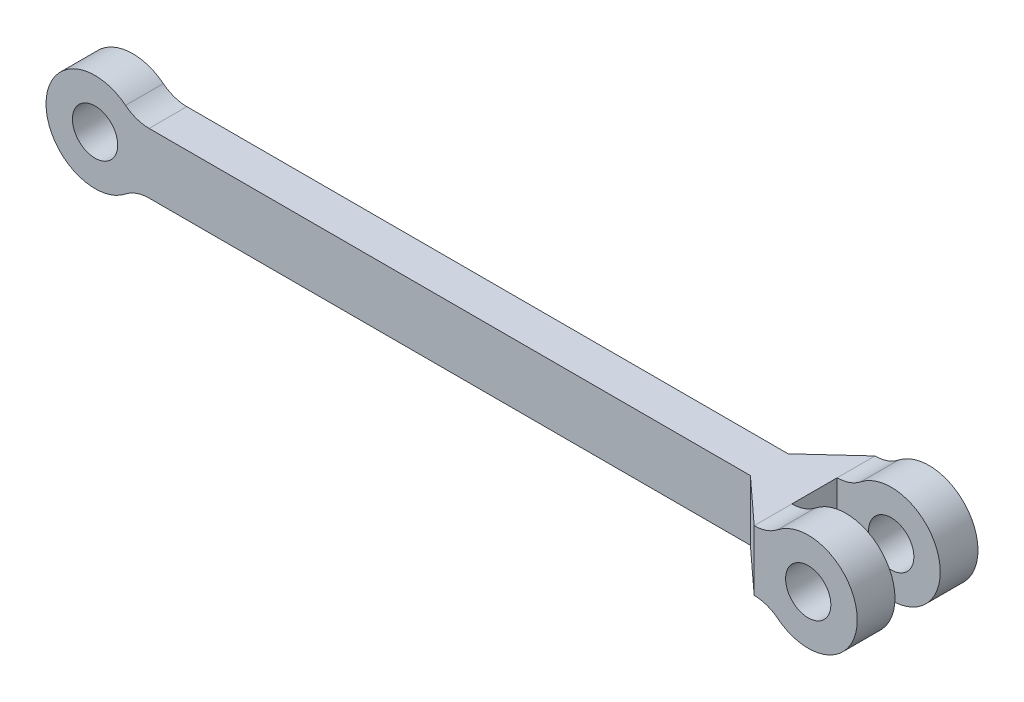
ISO-10303-21;
HEADER;
FILE_DESCRIPTION(('STEP AP214'),'2;1');
FILE_NAME('part.step','',(''),(''),'','','');
FILE_SCHEMA(('AUTOMOTIVE_DESIGN { 1 0 10303 214 1 1 1 1 }'));
ENDSEC;
DATA;
#1=APPLICATION_CONTEXT('core data for automotive mechanical design processes');
#2=APPLICATION_PROTOCOL_DEFINITION('international standard','automotive_design',2000,#1);
#3=PRODUCT_CONTEXT('',#1,'mechanical');
#4=PRODUCT('Part','Part','',(#3));
#5=PRODUCT_RELATED_PRODUCT_CATEGORY('part','',(#4));
#6=PRODUCT_DEFINITION_FORMATION('','',#4);
#7=PRODUCT_DEFINITION_CONTEXT('part definition',#1,'design');
#8=PRODUCT_DEFINITION('design','',#6,#7);
#9=PRODUCT_DEFINITION_SHAPE('','',#8);
#10=(LENGTH_UNIT() NAMED_UNIT(*) SI_UNIT(.MILLI.,.METRE.));
#11=(NAMED_UNIT(*) PLANE_ANGLE_UNIT() SI_UNIT($,.RADIAN.));
#12=(NAMED_UNIT(*) SI_UNIT($,.STERADIAN.) SOLID_ANGLE_UNIT());
#13=UNCERTAINTY_MEASURE_WITH_UNIT(LENGTH_MEASURE(1.E-05),#10,'distance_accuracy_value','');
#14=(GEOMETRIC_REPRESENTATION_CONTEXT(3) GLOBAL_UNCERTAINTY_ASSIGNED_CONTEXT((#13)) GLOBAL_UNIT_ASSIGNED_CONTEXT((#10,
#11,#12)) REPRESENTATION_CONTEXT('',''));
#15=CARTESIAN_POINT('',(0.,0.,0.));
#16=DIRECTION('',(0.,0.,1.));
#17=DIRECTION('',(1.,0.,0.));
#18=AXIS2_PLACEMENT_3D('',#15,#16,#17);
#19=CARTESIAN_POINT('',(928.410894683618,-90.,25.));
#20=DIRECTION('',(0.,0.,-1.));
#21=DIRECTION('',(-1.,0.,0.));
#22=AXIS2_PLACEMENT_3D('',#19,#20,#21);
#23=CYLINDRICAL_SURFACE('',#22,50.);
#24=DIRECTION('',(0.,0.,-1.));
#25=VECTOR('',#24,1.);
#26=CARTESIAN_POINT('',(928.410894683618,-40.,25.));
#27=LINE('',#26,#25);
#28=CARTESIAN_POINT('',(928.410894683618,-40.,80.));
#29=VERTEX_POINT('',#28);
#30=CARTESIAN_POINT('',(928.410894683618,-40.,30.));
#31=VERTEX_POINT('',#30);
#32=EDGE_CURVE('E160',#29,#31,#27,.T.);
#33=ORIENTED_EDGE('',*,*,#32,.T.);
#34=CARTESIAN_POINT('',(928.410894683618,-90.,30.));
#35=DIRECTION('',(0.,0.,1.));
#36=DIRECTION('',(1.,0.,0.));
#37=AXIS2_PLACEMENT_3D('',#34,#35,#36);
#38=CIRCLE('',#37,50.);
#39=CARTESIAN_POINT('',(959.536592647262,-50.8695652173913,30.));
#40=VERTEX_POINT('',#39);
#41=EDGE_CURVE('E229',#31,#40,#38,.F.);
#42=ORIENTED_EDGE('',*,*,#41,.T.);
#43=DIRECTION('',(0.,0.,-1.));
#44=VECTOR('',#43,1.);
#45=CARTESIAN_POINT('',(959.536592647262,-50.8695652173913,25.));
#46=LINE('',#45,#44);
#47=CARTESIAN_POINT('',(959.536592647262,-50.8695652173913,80.));
#48=VERTEX_POINT('',#47);
#49=EDGE_CURVE('E202',#48,#40,#46,.T.);
#50=ORIENTED_EDGE('',*,*,#49,.F.);
#51=CARTESIAN_POINT('',(928.410894683618,-90.,80.));
#52=DIRECTION('',(0.,0.,-1.));
#53=DIRECTION('',(1.,0.,0.));
#54=AXIS2_PLACEMENT_3D('',#51,#52,#53);
#55=CIRCLE('',#54,50.);
#56=EDGE_CURVE('E248',#29,#48,#55,.T.);
#57=ORIENTED_EDGE('',*,*,#56,.F.);
#58=EDGE_LOOP('',(#33,#42,#50,#57));
#59=FACE_BOUND('',#58,.T.);
#60=ADVANCED_FACE('F33',(#59),#23,.F.);
#61=CARTESIAN_POINT('',(1000.,0.,25.));
#62=DIRECTION('',(0.,0.,-1.));
#63=DIRECTION('',(-1.,0.,0.));
#64=AXIS2_PLACEMENT_3D('',#61,#62,#63);
#65=CYLINDRICAL_SURFACE('',#64,65.);
#66=DIRECTION('',(0.,0.,-1.));
#67=VECTOR('',#66,1.);
#68=CARTESIAN_POINT('',(959.536592647262,50.8695652173913,25.));
#69=LINE('',#68,#67);
#70=CARTESIAN_POINT('',(959.536592647262,50.8695652173913,-30.));
#71=VERTEX_POINT('',#70);
#72=CARTESIAN_POINT('',(959.536592647262,50.8695652173913,-80.));
#73=VERTEX_POINT('',#72);
#74=EDGE_CURVE('E197',#71,#73,#69,.T.);
#75=ORIENTED_EDGE('',*,*,#74,.F.);
#76=CARTESIAN_POINT('',(1000.,0.,-30.));
#77=DIRECTION('',(0.,0.,-1.));
#78=DIRECTION('',(-1.,0.,0.));
#79=AXIS2_PLACEMENT_3D('',#76,#77,#78);
#80=CIRCLE('',#79,65.);
#81=CARTESIAN_POINT('',(959.536592647262,-50.8695652173913,-30.));
#82=VERTEX_POINT('',#81);
#83=EDGE_CURVE('E212',#71,#82,#80,.T.);
#84=ORIENTED_EDGE('',*,*,#83,.T.);
#85=CARTESIAN_POINT('',(959.536592647262,-50.8695652173913,-80.));
#86=VERTEX_POINT('',#85);
#87=EDGE_CURVE('E201',#82,#86,#46,.T.);
#88=ORIENTED_EDGE('',*,*,#87,.T.);
#89=CARTESIAN_POINT('',(1000.,0.,-80.));
#90=DIRECTION('',(0.,0.,1.));
#91=DIRECTION('',(1.,0.,0.));
#92=AXIS2_PLACEMENT_3D('',#89,#90,#91);
#93=CIRCLE('',#92,65.);
#94=EDGE_CURVE('E260',#86,#73,#93,.T.);
#95=ORIENTED_EDGE('',*,*,#94,.T.);
#96=EDGE_LOOP('',(#75,#84,#88,#95));
#97=FACE_BOUND('',#96,.T.);
#98=ADVANCED_FACE('F310',(#97),#65,.T.);
#99=CARTESIAN_POINT('',(928.410894683618,90.,25.));
#100=DIRECTION('',(0.,0.,-1.));
#101=DIRECTION('',(-1.,0.,0.));
#102=AXIS2_PLACEMENT_3D('',#99,#100,#101);
#103=CYLINDRICAL_SURFACE('',#102,50.);
#104=CARTESIAN_POINT('',(959.536592647262,50.8695652173913,80.));
#105=VERTEX_POINT('',#104);
#106=CARTESIAN_POINT('',(959.536592647262,50.8695652173913,30.));
#107=VERTEX_POINT('',#106);
#108=EDGE_CURVE('E198',#105,#107,#69,.T.);
#109=ORIENTED_EDGE('',*,*,#108,.T.);
#110=CARTESIAN_POINT('',(928.410894683618,90.,30.));
#111=DIRECTION('',(0.,0.,1.));
#112=DIRECTION('',(1.,0.,0.));
#113=AXIS2_PLACEMENT_3D('',#110,#111,#112);
#114=CIRCLE('',#113,50.);
#115=CARTESIAN_POINT('',(928.410894683618,40.,30.));
#116=VERTEX_POINT('',#115);
#117=EDGE_CURVE('E224',#107,#116,#114,.F.);
#118=ORIENTED_EDGE('',*,*,#117,.T.);
#119=DIRECTION('',(0.,0.,-1.));
#120=VECTOR('',#119,1.);
#121=CARTESIAN_POINT('',(928.410894683618,40.,25.));
#122=LINE('',#121,#120);
#123=CARTESIAN_POINT('',(928.410894683618,40.,80.));
#124=VERTEX_POINT('',#123);
#125=EDGE_CURVE('E194',#124,#116,#122,.T.);
#126=ORIENTED_EDGE('',*,*,#125,.F.);
#127=CARTESIAN_POINT('',(928.410894683618,90.,80.));
#128=DIRECTION('',(0.,0.,-1.));
#129=DIRECTION('',(1.,0.,0.));
#130=AXIS2_PLACEMENT_3D('',#127,#128,#129);
#131=CIRCLE('',#130,50.);
#132=EDGE_CURVE('E255',#105,#124,#131,.T.);
#133=ORIENTED_EDGE('',*,*,#132,.F.);
#134=EDGE_LOOP('',(#109,#118,#126,#133));
#135=FACE_BOUND('',#134,.T.);
#136=ADVANCED_FACE('F312',(#135),#103,.F.);
#137=CARTESIAN_POINT('',(1000.,0.,25.));
#138=DIRECTION('',(0.,0.,-1.));
#139=DIRECTION('',(-1.,0.,0.));
#140=AXIS2_PLACEMENT_3D('',#137,#138,#139);
#141=CYLINDRICAL_SURFACE('',#140,30.);
#142=CARTESIAN_POINT('',(1000.,0.,30.));
#143=DIRECTION('',(0.,0.,1.));
#144=DIRECTION('',(1.,0.,0.));
#145=AXIS2_PLACEMENT_3D('',#142,#143,#144);
#146=CIRCLE('',#145,30.);
#147=CARTESIAN_POINT('',(1030.,0.,30.));
#148=VERTEX_POINT('',#147);
#149=EDGE_CURVE('E37',#148,#148,#146,.T.);
#150=ORIENTED_EDGE('',*,*,#149,.F.);
#151=EDGE_LOOP('',(#150));
#152=FACE_BOUND('',#151,.T.);
#153=CARTESIAN_POINT('',(1000.,0.,80.));
#154=DIRECTION('',(0.,0.,1.));
#155=DIRECTION('',(1.,0.,0.));
#156=AXIS2_PLACEMENT_3D('',#153,#154,#155);
#157=CIRCLE('',#156,30.);
#158=CARTESIAN_POINT('',(1030.,0.,80.));
#159=VERTEX_POINT('',#158);
#160=EDGE_CURVE('E242',#159,#159,#157,.T.);
#161=ORIENTED_EDGE('',*,*,#160,.T.);
#162=EDGE_LOOP('',(#161));
#163=FACE_BOUND('',#162,.T.);
#164=ADVANCED_FACE('F318',(#152,#163),#141,.F.);
#165=CARTESIAN_POINT('',(928.410894683618,-90.,25.));
#166=DIRECTION('',(0.,0.,-1.));
#167=DIRECTION('',(-1.,0.,0.));
#168=AXIS2_PLACEMENT_3D('',#165,#166,#167);
#169=PLANE('',#168);
#170=CARTESIAN_POINT('',(0.,0.,25.));
#171=DIRECTION('',(0.,0.,1.));
#172=DIRECTION('',(1.,0.,0.));
#173=AXIS2_PLACEMENT_3D('',#170,#171,#172);
#174=CIRCLE('',#173,30.);
#175=CARTESIAN_POINT('',(30.,0.,25.));
#176=VERTEX_POINT('',#175);
#177=EDGE_CURVE('E175',#176,#176,#174,.T.);
#178=ORIENTED_EDGE('',*,*,#177,.F.);
#179=EDGE_LOOP('',(#178));
#180=FACE_BOUND('',#179,.T.);
#181=DIRECTION('',(0.,-1.,0.));
#182=VECTOR('',#181,1.);
#183=CARTESIAN_POINT('',(868.410894683618,-90.,25.));
#184=LINE('',#183,#182);
#185=CARTESIAN_POINT('',(868.410894683618,40.,25.));
#186=VERTEX_POINT('',#185);
#187=CARTESIAN_POINT('',(868.410894683618,-40.,25.));
#188=VERTEX_POINT('',#187);
#189=EDGE_CURVE('E143',#186,#188,#184,.T.);
#190=ORIENTED_EDGE('',*,*,#189,.F.);
#191=DIRECTION('',(-1.,0.,0.));
#192=VECTOR('',#191,1.);
#193=CARTESIAN_POINT('',(71.5891053163818,40.,25.));
#194=LINE('',#193,#192);
#195=CARTESIAN_POINT('',(71.5891053163818,40.,25.));
#196=VERTEX_POINT('',#195);
#197=EDGE_CURVE('E87',#186,#196,#194,.T.);
#198=ORIENTED_EDGE('',*,*,#197,.T.);
#199=CARTESIAN_POINT('',(71.5891053163818,90.,25.));
#200=DIRECTION('',(0.,0.,-1.));
#201=DIRECTION('',(-1.,0.,0.));
#202=AXIS2_PLACEMENT_3D('',#199,#200,#201);
#203=CIRCLE('',#202,50.);
#204=CARTESIAN_POINT('',(40.4634073527375,50.8695652173913,25.));
#205=VERTEX_POINT('',#204);
#206=EDGE_CURVE('E272',#196,#205,#203,.T.);
#207=ORIENTED_EDGE('',*,*,#206,.T.);
#208=CARTESIAN_POINT('',(0.,0.,25.));
#209=DIRECTION('',(0.,0.,1.));
#210=DIRECTION('',(1.,0.,0.));
#211=AXIS2_PLACEMENT_3D('',#208,#209,#210);
#212=CIRCLE('',#211,65.);
#213=CARTESIAN_POINT('',(40.4634073527375,-50.8695652173913,25.));
#214=VERTEX_POINT('',#213);
#215=EDGE_CURVE('E168',#205,#214,#212,.T.);
#216=ORIENTED_EDGE('',*,*,#215,.T.);
#217=CARTESIAN_POINT('',(71.5891053163818,-90.,25.));
#218=DIRECTION('',(0.,0.,-1.));
#219=DIRECTION('',(1.,0.,0.));
#220=AXIS2_PLACEMENT_3D('',#217,#218,#219);
#221=CIRCLE('',#220,50.);
#222=CARTESIAN_POINT('',(71.5891053163818,-40.,25.));
#223=VERTEX_POINT('',#222);
#224=EDGE_CURVE('E59',#214,#223,#221,.T.);
#225=ORIENTED_EDGE('',*,*,#224,.T.);
#226=DIRECTION('',(1.,0.,0.));
#227=VECTOR('',#226,1.);
#228=CARTESIAN_POINT('',(71.5891053163818,-40.,25.));
#229=LINE('',#228,#227);
#230=EDGE_CURVE('E157',#223,#188,#229,.T.);
#231=ORIENTED_EDGE('',*,*,#230,.T.);
#232=EDGE_LOOP('',(#190,#198,#207,#216,#225,#231));
#233=FACE_BOUND('',#232,.T.);
#234=ADVANCED_FACE('F163',(#180,#233),#169,.F.);
#235=CARTESIAN_POINT('',(928.410894683618,-90.,-25.));
#236=DIRECTION('',(0.,0.,-1.));
#237=DIRECTION('',(-1.,0.,0.));
#238=AXIS2_PLACEMENT_3D('',#235,#236,#237);
#239=PLANE('',#238);
#240=CARTESIAN_POINT('',(0.,0.,-25.));
#241=DIRECTION('',(0.,0.,1.));
#242=DIRECTION('',(1.,0.,0.));
#243=AXIS2_PLACEMENT_3D('',#240,#241,#242);
#244=CIRCLE('',#243,30.);
#245=CARTESIAN_POINT('',(30.,0.,-25.));
#246=VERTEX_POINT('',#245);
#247=EDGE_CURVE('E150',#246,#246,#244,.T.);
#248=ORIENTED_EDGE('',*,*,#247,.T.);
#249=EDGE_LOOP('',(#248));
#250=FACE_BOUND('',#249,.T.);
#251=DIRECTION('',(-1.,0.,0.));
#252=VECTOR('',#251,1.);
#253=CARTESIAN_POINT('',(71.5891053163818,40.,-25.));
#254=LINE('',#253,#252);
#255=CARTESIAN_POINT('',(868.410894683618,40.,-25.));
#256=VERTEX_POINT('',#255);
#257=CARTESIAN_POINT('',(71.5891053163818,40.,-25.));
#258=VERTEX_POINT('',#257);
#259=EDGE_CURVE('E172',#256,#258,#254,.T.);
#260=ORIENTED_EDGE('',*,*,#259,.F.);
#261=DIRECTION('',(0.,-1.,0.));
#262=VECTOR('',#261,1.);
#263=CARTESIAN_POINT('',(868.410894683618,-90.,-25.));
#264=LINE('',#263,#262);
#265=CARTESIAN_POINT('',(868.410894683618,-40.,-25.));
#266=VERTEX_POINT('',#265);
#267=EDGE_CURVE('E151',#256,#266,#264,.T.);
#268=ORIENTED_EDGE('',*,*,#267,.T.);
#269=DIRECTION('',(1.,0.,0.));
#270=VECTOR('',#269,1.);
#271=CARTESIAN_POINT('',(71.5891053163818,-40.,-25.));
#272=LINE('',#271,#270);
#273=CARTESIAN_POINT('',(71.5891053163818,-40.,-25.));
#274=VERTEX_POINT('',#273);
#275=EDGE_CURVE('E180',#274,#266,#272,.T.);
#276=ORIENTED_EDGE('',*,*,#275,.F.);
#277=CARTESIAN_POINT('',(71.5891053163818,-90.,-25.));
#278=DIRECTION('',(0.,0.,-1.));
#279=DIRECTION('',(1.,0.,0.));
#280=AXIS2_PLACEMENT_3D('',#277,#278,#279);
#281=CIRCLE('',#280,50.);
#282=CARTESIAN_POINT('',(40.4634073527375,-50.8695652173913,-25.));
#283=VERTEX_POINT('',#282);
#284=EDGE_CURVE('E80',#283,#274,#281,.T.);
#285=ORIENTED_EDGE('',*,*,#284,.F.);
#286=CARTESIAN_POINT('',(0.,0.,-25.));
#287=DIRECTION('',(0.,0.,1.));
#288=DIRECTION('',(1.,0.,0.));
#289=AXIS2_PLACEMENT_3D('',#286,#287,#288);
#290=CIRCLE('',#289,65.);
#291=CARTESIAN_POINT('',(40.4634073527375,50.8695652173913,-25.));
#292=VERTEX_POINT('',#291);
#293=EDGE_CURVE('E177',#292,#283,#290,.T.);
#294=ORIENTED_EDGE('',*,*,#293,.F.);
#295=CARTESIAN_POINT('',(71.5891053163818,90.,-25.));
#296=DIRECTION('',(0.,0.,-1.));
#297=DIRECTION('',(-1.,0.,0.));
#298=AXIS2_PLACEMENT_3D('',#295,#296,#297);
#299=CIRCLE('',#298,50.);
#300=EDGE_CURVE('E174',#258,#292,#299,.T.);
#301=ORIENTED_EDGE('',*,*,#300,.F.);
#302=EDGE_LOOP('',(#260,#268,#276,#285,#294,#301));
#303=FACE_BOUND('',#302,.T.);
#304=ADVANCED_FACE('F284',(#250,#303),#239,.T.);
#305=ORIENTED_EDGE('',*,*,#87,.F.);
#306=CARTESIAN_POINT('',(928.410894683618,-90.,-30.));
#307=DIRECTION('',(0.,0.,-1.));
#308=DIRECTION('',(-1.,0.,0.));
#309=AXIS2_PLACEMENT_3D('',#306,#307,#308);
#310=CIRCLE('',#309,50.);
#311=CARTESIAN_POINT('',(928.410894683618,-40.,-30.));
#312=VERTEX_POINT('',#311);
#313=EDGE_CURVE('E221',#82,#312,#310,.F.);
#314=ORIENTED_EDGE('',*,*,#313,.T.);
#315=CARTESIAN_POINT('',(928.410894683618,-40.,-80.));
#316=VERTEX_POINT('',#315);
#317=EDGE_CURVE('E164',#312,#316,#27,.T.);
#318=ORIENTED_EDGE('',*,*,#317,.T.);
#319=CARTESIAN_POINT('',(928.410894683618,-90.,-80.));
#320=DIRECTION('',(0.,0.,-1.));
#321=DIRECTION('',(1.,0.,0.));
#322=AXIS2_PLACEMENT_3D('',#319,#320,#321);
#323=CIRCLE('',#322,50.);
#324=EDGE_CURVE('E245',#316,#86,#323,.T.);
#325=ORIENTED_EDGE('',*,*,#324,.T.);
#326=EDGE_LOOP('',(#305,#314,#318,#325));
#327=FACE_BOUND('',#326,.T.);
#328=ADVANCED_FACE('F35',(#327),#23,.F.);
#329=ORIENTED_EDGE('',*,*,#49,.T.);
#330=CARTESIAN_POINT('',(1000.,0.,30.));
#331=DIRECTION('',(0.,0.,1.));
#332=DIRECTION('',(1.,0.,0.));
#333=AXIS2_PLACEMENT_3D('',#330,#331,#332);
#334=CIRCLE('',#333,65.);
#335=EDGE_CURVE('E227',#40,#107,#334,.T.);
#336=ORIENTED_EDGE('',*,*,#335,.T.);
#337=ORIENTED_EDGE('',*,*,#108,.F.);
#338=CARTESIAN_POINT('',(1000.,0.,80.));
#339=DIRECTION('',(0.,0.,1.));
#340=DIRECTION('',(1.,0.,0.));
#341=AXIS2_PLACEMENT_3D('',#338,#339,#340);
#342=CIRCLE('',#341,65.);
#343=EDGE_CURVE('E251',#48,#105,#342,.T.);
#344=ORIENTED_EDGE('',*,*,#343,.F.);
#345=EDGE_LOOP('',(#329,#336,#337,#344));
#346=FACE_BOUND('',#345,.T.);
#347=ADVANCED_FACE('F313',(#346),#65,.T.);
#348=CARTESIAN_POINT('',(928.410894683618,40.,-30.));
#349=VERTEX_POINT('',#348);
#350=CARTESIAN_POINT('',(928.410894683618,40.,-80.));
#351=VERTEX_POINT('',#350);
#352=EDGE_CURVE('E193',#349,#351,#122,.T.);
#353=ORIENTED_EDGE('',*,*,#352,.F.);
#354=CARTESIAN_POINT('',(928.410894683618,90.,-30.));
#355=DIRECTION('',(0.,0.,-1.));
#356=DIRECTION('',(-1.,0.,0.));
#357=AXIS2_PLACEMENT_3D('',#354,#355,#356);
#358=CIRCLE('',#357,50.);
#359=EDGE_CURVE('E208',#349,#71,#358,.F.);
#360=ORIENTED_EDGE('',*,*,#359,.T.);
#361=ORIENTED_EDGE('',*,*,#74,.T.);
#362=CARTESIAN_POINT('',(928.410894683618,90.,-80.));
#363=DIRECTION('',(0.,0.,-1.));
#364=DIRECTION('',(1.,0.,0.));
#365=AXIS2_PLACEMENT_3D('',#362,#363,#364);
#366=CIRCLE('',#365,50.);
#367=EDGE_CURVE('E252',#73,#351,#366,.T.);
#368=ORIENTED_EDGE('',*,*,#367,.T.);
#369=EDGE_LOOP('',(#353,#360,#361,#368));
#370=FACE_BOUND('',#369,.T.);
#371=ADVANCED_FACE('F293',(#370),#103,.F.);
#372=CARTESIAN_POINT('',(71.5891053163818,40.,25.));
#373=DIRECTION('',(0.,-1.,0.));
#374=DIRECTION('',(1.,0.,0.));
#375=AXIS2_PLACEMENT_3D('',#372,#373,#374);
#376=PLANE('',#375);
#377=ORIENTED_EDGE('',*,*,#197,.F.);
#378=DIRECTION('',(0.737154140200741,0.,0.675724628517347));
#379=VECTOR('',#378,1.);
#380=CARTESIAN_POINT('',(435.420941216139,40.,-371.907457345189));
#381=LINE('',#380,#379);
#382=EDGE_CURVE('E149',#186,#124,#381,.T.);
#383=ORIENTED_EDGE('',*,*,#382,.T.);
#384=ORIENTED_EDGE('',*,*,#125,.T.);
#385=DIRECTION('',(0.,0.,-1.));
#386=VECTOR('',#385,1.);
#387=CARTESIAN_POINT('',(928.410894683618,40.,25.));
#388=LINE('',#387,#386);
#389=EDGE_CURVE('E232',#116,#349,#388,.T.);
#390=ORIENTED_EDGE('',*,*,#389,.T.);
#391=ORIENTED_EDGE('',*,*,#352,.T.);
#392=DIRECTION('',(-0.737154140200741,0.,0.675724628517347));
#393=VECTOR('',#392,1.);
#394=CARTESIAN_POINT('',(410.515280838781,40.,394.737646024435));
#395=LINE('',#394,#393);
#396=EDGE_CURVE('E238',#351,#256,#395,.T.);
#397=ORIENTED_EDGE('',*,*,#396,.T.);
#398=ORIENTED_EDGE('',*,*,#259,.T.);
#399=DIRECTION('',(0.,0.,-1.));
#400=VECTOR('',#399,1.);
#401=CARTESIAN_POINT('',(71.5891053163818,40.,25.));
#402=LINE('',#401,#400);
#403=EDGE_CURVE('E190',#196,#258,#402,.T.);
#404=ORIENTED_EDGE('',*,*,#403,.F.);
#405=EDGE_LOOP('',(#377,#383,#384,#390,#391,#397,#398,#404));
#406=FACE_BOUND('',#405,.T.);
#407=ADVANCED_FACE('F290',(#406),#376,.F.);
#408=CARTESIAN_POINT('',(71.5891053163818,90.,25.));
#409=DIRECTION('',(0.,0.,-1.));
#410=DIRECTION('',(-1.,0.,0.));
#411=AXIS2_PLACEMENT_3D('',#408,#409,#410);
#412=CYLINDRICAL_SURFACE('',#411,50.);
#413=ORIENTED_EDGE('',*,*,#300,.T.);
#414=DIRECTION('',(0.,0.,-1.));
#415=VECTOR('',#414,1.);
#416=CARTESIAN_POINT('',(40.4634073527375,50.8695652173913,25.));
#417=LINE('',#416,#415);
#418=EDGE_CURVE('E187',#205,#292,#417,.T.);
#419=ORIENTED_EDGE('',*,*,#418,.F.);
#420=ORIENTED_EDGE('',*,*,#206,.F.);
#421=ORIENTED_EDGE('',*,*,#403,.T.);
#422=EDGE_LOOP('',(#413,#419,#420,#421));
#423=FACE_BOUND('',#422,.T.);
#424=ADVANCED_FACE('F475',(#423),#412,.F.);
#425=CARTESIAN_POINT('',(0.,0.,25.));
#426=DIRECTION('',(0.,0.,-1.));
#427=DIRECTION('',(-1.,0.,0.));
#428=AXIS2_PLACEMENT_3D('',#425,#426,#427);
#429=CYLINDRICAL_SURFACE('',#428,65.);
#430=ORIENTED_EDGE('',*,*,#293,.T.);
#431=DIRECTION('',(0.,0.,-1.));
#432=VECTOR('',#431,1.);
#433=CARTESIAN_POINT('',(40.4634073527375,-50.8695652173913,25.));
#434=LINE('',#433,#432);
#435=EDGE_CURVE('E185',#214,#283,#434,.T.);
#436=ORIENTED_EDGE('',*,*,#435,.F.);
#437=ORIENTED_EDGE('',*,*,#215,.F.);
#438=ORIENTED_EDGE('',*,*,#418,.T.);
#439=EDGE_LOOP('',(#430,#436,#437,#438));
#440=FACE_BOUND('',#439,.T.);
#441=ADVANCED_FACE('F278',(#440),#429,.T.);
#442=CARTESIAN_POINT('',(71.5891053163818,-90.,25.));
#443=DIRECTION('',(0.,0.,-1.));
#444=DIRECTION('',(-1.,0.,0.));
#445=AXIS2_PLACEMENT_3D('',#442,#443,#444);
#446=CYLINDRICAL_SURFACE('',#445,50.);
#447=ORIENTED_EDGE('',*,*,#284,.T.);
#448=DIRECTION('',(0.,0.,-1.));
#449=VECTOR('',#448,1.);
#450=CARTESIAN_POINT('',(71.5891053163818,-40.,25.));
#451=LINE('',#450,#449);
#452=EDGE_CURVE('E183',#223,#274,#451,.T.);
#453=ORIENTED_EDGE('',*,*,#452,.F.);
#454=ORIENTED_EDGE('',*,*,#224,.F.);
#455=ORIENTED_EDGE('',*,*,#435,.T.);
#456=EDGE_LOOP('',(#447,#453,#454,#455));
#457=FACE_BOUND('',#456,.T.);
#458=ADVANCED_FACE('F280',(#457),#446,.F.);
#459=CARTESIAN_POINT('',(71.5891053163818,-40.,25.));
#460=DIRECTION('',(0.,1.,0.));
#461=DIRECTION('',(-1.,0.,0.));
#462=AXIS2_PLACEMENT_3D('',#459,#460,#461);
#463=PLANE('',#462);
#464=ORIENTED_EDGE('',*,*,#32,.F.);
#465=DIRECTION('',(-0.737154140200741,0.,-0.675724628517347));
#466=VECTOR('',#465,1.);
#467=CARTESIAN_POINT('',(435.420941216139,-40.,-371.907457345189));
#468=LINE('',#467,#466);
#469=EDGE_CURVE('E146',#29,#188,#468,.T.);
#470=ORIENTED_EDGE('',*,*,#469,.T.);
#471=ORIENTED_EDGE('',*,*,#230,.F.);
#472=ORIENTED_EDGE('',*,*,#452,.T.);
#473=ORIENTED_EDGE('',*,*,#275,.T.);
#474=DIRECTION('',(0.737154140200741,0.,-0.675724628517347));
#475=VECTOR('',#474,1.);
#476=CARTESIAN_POINT('',(410.515280838781,-40.,394.737646024435));
#477=LINE('',#476,#475);
#478=EDGE_CURVE('E235',#266,#316,#477,.T.);
#479=ORIENTED_EDGE('',*,*,#478,.T.);
#480=ORIENTED_EDGE('',*,*,#317,.F.);
#481=EDGE_CURVE('E166',#31,#312,#27,.T.);
#482=ORIENTED_EDGE('',*,*,#481,.F.);
#483=EDGE_LOOP('',(#464,#470,#471,#472,#473,#479,#480,#482));
#484=FACE_BOUND('',#483,.T.);
#485=ADVANCED_FACE('F156',(#484),#463,.F.);
#486=CARTESIAN_POINT('',(0.,0.,25.));
#487=DIRECTION('',(0.,0.,-1.));
#488=DIRECTION('',(-1.,0.,0.));
#489=AXIS2_PLACEMENT_3D('',#486,#487,#488);
#490=CYLINDRICAL_SURFACE('',#489,30.);
#491=ORIENTED_EDGE('',*,*,#177,.T.);
#492=EDGE_LOOP('',(#491));
#493=FACE_BOUND('',#492,.T.);
#494=ORIENTED_EDGE('',*,*,#247,.F.);
#495=EDGE_LOOP('',(#494));
#496=FACE_BOUND('',#495,.T.);
#497=ADVANCED_FACE('F356',(#493,#496),#490,.F.);
#498=CARTESIAN_POINT('',(928.410894683618,-90.,-80.));
#499=DIRECTION('',(0.,0.,1.));
#500=DIRECTION('',(1.,0.,0.));
#501=AXIS2_PLACEMENT_3D('',#498,#499,#500);
#502=PLANE('',#501);
#503=ORIENTED_EDGE('',*,*,#324,.F.);
#504=DIRECTION('',(0.,1.,0.));
#505=VECTOR('',#504,1.);
#506=CARTESIAN_POINT('',(928.410894683618,-90.,-80.));
#507=LINE('',#506,#505);
#508=EDGE_CURVE('E42',#316,#351,#507,.T.);
#509=ORIENTED_EDGE('',*,*,#508,.T.);
#510=ORIENTED_EDGE('',*,*,#367,.F.);
#511=ORIENTED_EDGE('',*,*,#94,.F.);
#512=EDGE_LOOP('',(#503,#509,#510,#511));
#513=FACE_BOUND('',#512,.T.);
#514=CARTESIAN_POINT('',(1000.,0.,-80.));
#515=DIRECTION('',(0.,0.,1.));
#516=DIRECTION('',(1.,0.,0.));
#517=AXIS2_PLACEMENT_3D('',#514,#515,#516);
#518=CIRCLE('',#517,30.);
#519=CARTESIAN_POINT('',(1030.,0.,-80.));
#520=VERTEX_POINT('',#519);
#521=EDGE_CURVE('E241',#520,#520,#518,.T.);
#522=ORIENTED_EDGE('',*,*,#521,.T.);
#523=EDGE_LOOP('',(#522));
#524=FACE_BOUND('',#523,.T.);
#525=ADVANCED_FACE('F299',(#513,#524),#502,.F.);
#526=CARTESIAN_POINT('',(1000.,0.,-30.));
#527=DIRECTION('',(0.,0.,-1.));
#528=DIRECTION('',(-1.,0.,0.));
#529=AXIS2_PLACEMENT_3D('',#526,#527,#528);
#530=CIRCLE('',#529,30.);
#531=CARTESIAN_POINT('',(970.,0.,-30.));
#532=VERTEX_POINT('',#531);
#533=EDGE_CURVE('E206',#532,#532,#530,.T.);
#534=ORIENTED_EDGE('',*,*,#533,.F.);
#535=EDGE_LOOP('',(#534));
#536=FACE_BOUND('',#535,.T.);
#537=ORIENTED_EDGE('',*,*,#521,.F.);
#538=EDGE_LOOP('',(#537));
#539=FACE_BOUND('',#538,.T.);
#540=ADVANCED_FACE('F337',(#536,#539),#141,.F.);
#541=CARTESIAN_POINT('',(928.410894683618,-90.,80.));
#542=DIRECTION('',(0.,0.,1.));
#543=DIRECTION('',(1.,0.,0.));
#544=AXIS2_PLACEMENT_3D('',#541,#542,#543);
#545=PLANE('',#544);
#546=DIRECTION('',(0.,1.,0.));
#547=VECTOR('',#546,1.);
#548=CARTESIAN_POINT('',(928.410894683618,-90.,80.));
#549=LINE('',#548,#547);
#550=EDGE_CURVE('E11',#29,#124,#549,.T.);
#551=ORIENTED_EDGE('',*,*,#550,.F.);
#552=ORIENTED_EDGE('',*,*,#56,.T.);
#553=ORIENTED_EDGE('',*,*,#343,.T.);
#554=ORIENTED_EDGE('',*,*,#132,.T.);
#555=EDGE_LOOP('',(#551,#552,#553,#554));
#556=FACE_BOUND('',#555,.T.);
#557=ORIENTED_EDGE('',*,*,#160,.F.);
#558=EDGE_LOOP('',(#557));
#559=FACE_BOUND('',#558,.T.);
#560=ADVANCED_FACE('F334',(#556,#559),#545,.T.);
#561=CARTESIAN_POINT('',(868.410894683618,-65.,-25.));
#562=DIRECTION('',(0.675724628517346,0.,0.737154140200741));
#563=DIRECTION('',(0.737154140200741,0.,-0.675724628517346));
#564=AXIS2_PLACEMENT_3D('',#561,#562,#563);
#565=PLANE('',#564);
#566=ORIENTED_EDGE('',*,*,#508,.F.);
#567=ORIENTED_EDGE('',*,*,#478,.F.);
#568=ORIENTED_EDGE('',*,*,#267,.F.);
#569=ORIENTED_EDGE('',*,*,#396,.F.);
#570=EDGE_LOOP('',(#566,#567,#568,#569));
#571=FACE_BOUND('',#570,.T.);
#572=ADVANCED_FACE('F289',(#571),#565,.F.);
#573=CARTESIAN_POINT('',(868.410894683618,-65.,25.));
#574=DIRECTION('',(0.675724628517346,0.,-0.737154140200741));
#575=DIRECTION('',(-0.737154140200741,0.,-0.675724628517346));
#576=AXIS2_PLACEMENT_3D('',#573,#574,#575);
#577=PLANE('',#576);
#578=ORIENTED_EDGE('',*,*,#189,.T.);
#579=ORIENTED_EDGE('',*,*,#469,.F.);
#580=ORIENTED_EDGE('',*,*,#550,.T.);
#581=ORIENTED_EDGE('',*,*,#382,.F.);
#582=EDGE_LOOP('',(#578,#579,#580,#581));
#583=FACE_BOUND('',#582,.T.);
#584=ADVANCED_FACE('F145',(#583),#577,.F.);
#585=CARTESIAN_POINT('',(928.410894683618,-65.,-30.));
#586=DIRECTION('',(-1.,0.,0.));
#587=DIRECTION('',(0.,-1.,0.));
#588=AXIS2_PLACEMENT_3D('',#585,#586,#587);
#589=PLANE('',#588);
#590=DIRECTION('',(0.,1.,0.));
#591=VECTOR('',#590,1.);
#592=CARTESIAN_POINT('',(928.410894683618,-65.,30.));
#593=LINE('',#592,#591);
#594=EDGE_CURVE('E50',#31,#116,#593,.T.);
#595=ORIENTED_EDGE('',*,*,#594,.F.);
#596=ORIENTED_EDGE('',*,*,#481,.T.);
#597=DIRECTION('',(0.,1.,0.));
#598=VECTOR('',#597,1.);
#599=CARTESIAN_POINT('',(928.410894683618,-65.,-30.));
#600=LINE('',#599,#598);
#601=EDGE_CURVE('E308',#312,#349,#600,.T.);
#602=ORIENTED_EDGE('',*,*,#601,.T.);
#603=ORIENTED_EDGE('',*,*,#389,.F.);
#604=EDGE_LOOP('',(#595,#596,#602,#603));
#605=FACE_BOUND('',#604,.T.);
#606=ADVANCED_FACE('F370',(#605),#589,.F.);
#607=CARTESIAN_POINT('',(928.410894683618,-65.,30.));
#608=DIRECTION('',(0.,0.,1.));
#609=DIRECTION('',(1.,0.,0.));
#610=AXIS2_PLACEMENT_3D('',#607,#608,#609);
#611=PLANE('',#610);
#612=ORIENTED_EDGE('',*,*,#149,.T.);
#613=EDGE_LOOP('',(#612));
#614=FACE_BOUND('',#613,.T.);
#615=ORIENTED_EDGE('',*,*,#594,.T.);
#616=ORIENTED_EDGE('',*,*,#117,.F.);
#617=ORIENTED_EDGE('',*,*,#335,.F.);
#618=ORIENTED_EDGE('',*,*,#41,.F.);
#619=EDGE_LOOP('',(#615,#616,#617,#618));
#620=FACE_BOUND('',#619,.T.);
#621=ADVANCED_FACE('F331',(#614,#620),#611,.F.);
#622=CARTESIAN_POINT('',(1065.,-65.,-30.));
#623=DIRECTION('',(0.,0.,-1.));
#624=DIRECTION('',(-1.,0.,0.));
#625=AXIS2_PLACEMENT_3D('',#622,#623,#624);
#626=PLANE('',#625);
#627=ORIENTED_EDGE('',*,*,#533,.T.);
#628=EDGE_LOOP('',(#627));
#629=FACE_BOUND('',#628,.T.);
#630=ORIENTED_EDGE('',*,*,#83,.F.);
#631=ORIENTED_EDGE('',*,*,#359,.F.);
#632=ORIENTED_EDGE('',*,*,#601,.F.);
#633=ORIENTED_EDGE('',*,*,#313,.F.);
#634=EDGE_LOOP('',(#630,#631,#632,#633));
#635=FACE_BOUND('',#634,.T.);
#636=ADVANCED_FACE('F306',(#629,#635),#626,.F.);
#637=CLOSED_SHELL('',(#60,#98,#136,#164,#234,#304,#328,#347,#371,#407,#424,#441,#458,#485,#497,
#525,#540,#560,#572,#584,#606,#621,#636));
#638=MANIFOLD_SOLID_BREP('B2',#637);
#639=ADVANCED_BREP_SHAPE_REPRESENTATION('',(#18,#638),#14);
#640=SHAPE_DEFINITION_REPRESENTATION(#9,#639);
ENDSEC;
END-ISO-10303-21;
